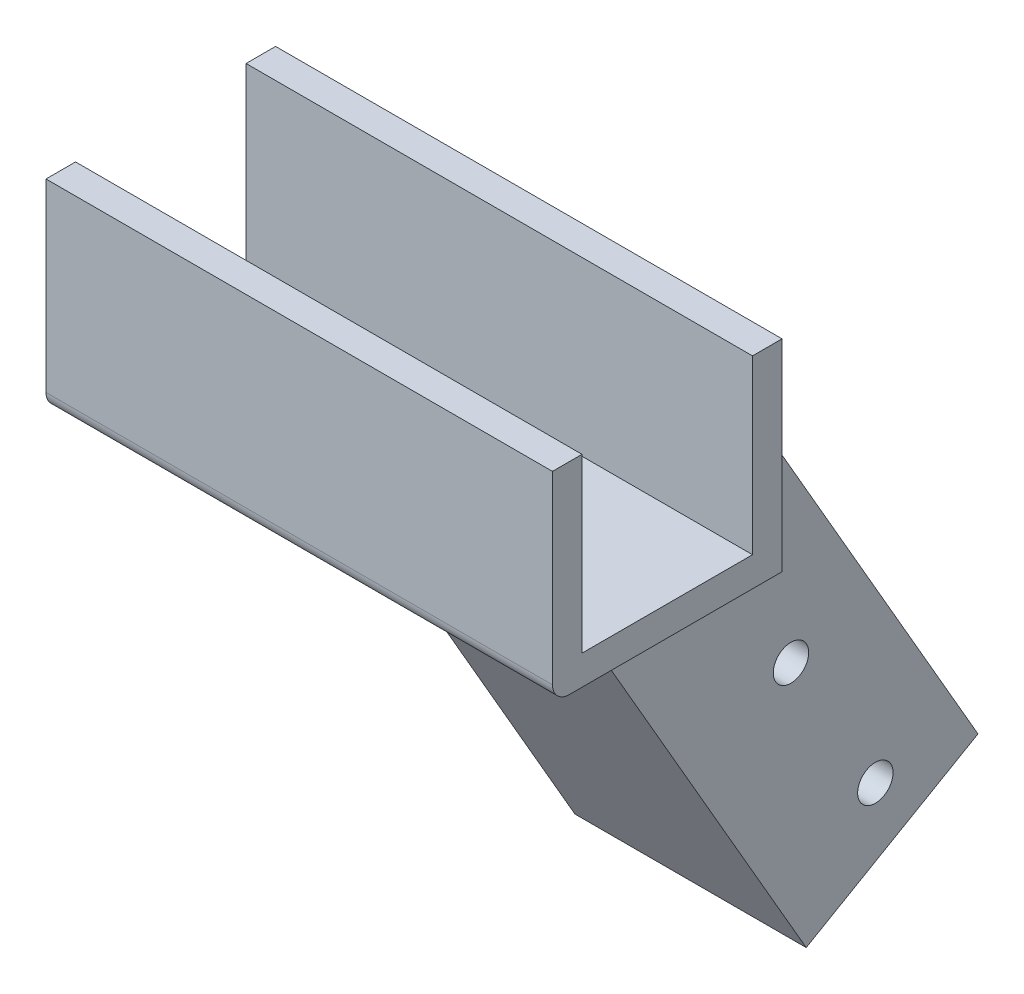
ISO-10303-21;
HEADER;
FILE_DESCRIPTION(('STEP AP214'),'2;1');
FILE_NAME('part.step','',(''),(''),'','','');
FILE_SCHEMA(('AUTOMOTIVE_DESIGN { 1 0 10303 214 1 1 1 1 }'));
ENDSEC;
DATA;
#1=APPLICATION_CONTEXT('core data for automotive mechanical design processes');
#2=APPLICATION_PROTOCOL_DEFINITION('international standard','automotive_design',2000,#1);
#3=PRODUCT_CONTEXT('',#1,'mechanical');
#4=PRODUCT('Part','Part','',(#3));
#5=PRODUCT_RELATED_PRODUCT_CATEGORY('part','',(#4));
#6=PRODUCT_DEFINITION_FORMATION('','',#4);
#7=PRODUCT_DEFINITION_CONTEXT('part definition',#1,'design');
#8=PRODUCT_DEFINITION('design','',#6,#7);
#9=PRODUCT_DEFINITION_SHAPE('','',#8);
#10=(LENGTH_UNIT() NAMED_UNIT(*) SI_UNIT(.MILLI.,.METRE.));
#11=(NAMED_UNIT(*) PLANE_ANGLE_UNIT() SI_UNIT($,.RADIAN.));
#12=(NAMED_UNIT(*) SI_UNIT($,.STERADIAN.) SOLID_ANGLE_UNIT());
#13=UNCERTAINTY_MEASURE_WITH_UNIT(LENGTH_MEASURE(1.E-05),#10,'distance_accuracy_value','');
#14=(GEOMETRIC_REPRESENTATION_CONTEXT(3) GLOBAL_UNCERTAINTY_ASSIGNED_CONTEXT((#13)) GLOBAL_UNIT_ASSIGNED_CONTEXT((#10,
#11,#12)) REPRESENTATION_CONTEXT('',''));
#15=CARTESIAN_POINT('',(0.,0.,0.));
#16=DIRECTION('',(0.,0.,1.));
#17=DIRECTION('',(1.,0.,0.));
#18=AXIS2_PLACEMENT_3D('',#15,#16,#17);
#19=CARTESIAN_POINT('',(13.7,-68.2416512459884,-32.7632087817198));
#20=DIRECTION('',(0.,0.866025403784438,0.500000000000001));
#21=DIRECTION('',(0.,-0.500000000000001,0.866025403784438));
#22=AXIS2_PLACEMENT_3D('',#19,#20,#21);
#23=PLANE('',#22);
#24=DIRECTION('',(0.,0.500000000000001,-0.866025403784438));
#25=VECTOR('',#24,1.);
#26=CARTESIAN_POINT('',(-10.2,-68.2416512459884,-32.7632087817198));
#27=LINE('',#26,#25);
#28=CARTESIAN_POINT('',(-10.2,-66.4916512459884,-35.7942976949653));
#29=VERTEX_POINT('',#28);
#30=CARTESIAN_POINT('',(-10.2,-56.4916512459884,-53.114805770654));
#31=VERTEX_POINT('',#30);
#32=EDGE_CURVE('E366',#29,#31,#27,.T.);
#33=ORIENTED_EDGE('',*,*,#32,.F.);
#34=DIRECTION('',(-1.,0.,0.));
#35=VECTOR('',#34,1.);
#36=CARTESIAN_POINT('',(13.7,-66.4916512459884,-35.7942976949653));
#37=LINE('',#36,#35);
#38=CARTESIAN_POINT('',(10.2,-66.4916512459884,-35.7942976949653));
#39=VERTEX_POINT('',#38);
#40=EDGE_CURVE('E196',#39,#29,#37,.T.);
#41=ORIENTED_EDGE('',*,*,#40,.F.);
#42=DIRECTION('',(0.,0.500000000000001,-0.866025403784438));
#43=VECTOR('',#42,1.);
#44=CARTESIAN_POINT('',(10.2,-68.2416512459884,-32.7632087817198));
#45=LINE('',#44,#43);
#46=CARTESIAN_POINT('',(10.2,-56.4916512459884,-53.114805770654));
#47=VERTEX_POINT('',#46);
#48=EDGE_CURVE('E180',#39,#47,#45,.T.);
#49=ORIENTED_EDGE('',*,*,#48,.T.);
#50=DIRECTION('',(-1.,0.,0.));
#51=VECTOR('',#50,1.);
#52=CARTESIAN_POINT('',(13.7,-56.4916512459884,-53.114805770654));
#53=LINE('',#52,#51);
#54=CARTESIAN_POINT('',(13.7,-56.4916512459884,-53.114805770654));
#55=VERTEX_POINT('',#54);
#56=EDGE_CURVE('E193',#55,#47,#53,.T.);
#57=ORIENTED_EDGE('',*,*,#56,.F.);
#58=DIRECTION('',(0.,0.500000000000001,-0.866025403784438));
#59=VECTOR('',#58,1.);
#60=CARTESIAN_POINT('',(13.7,-68.2416512459884,-32.7632087817198));
#61=LINE('',#60,#59);
#62=CARTESIAN_POINT('',(13.7,-68.2416512459884,-32.7632087817198));
#63=VERTEX_POINT('',#62);
#64=EDGE_CURVE('E325',#63,#55,#61,.T.);
#65=ORIENTED_EDGE('',*,*,#64,.F.);
#66=DIRECTION('',(-1.,0.,0.));
#67=VECTOR('',#66,1.);
#68=CARTESIAN_POINT('',(13.7,-68.2416512459884,-32.7632087817198));
#69=LINE('',#68,#67);
#70=CARTESIAN_POINT('',(-13.7,-68.2416512459884,-32.7632087817198));
#71=VERTEX_POINT('',#70);
#72=EDGE_CURVE('E204',#63,#71,#69,.T.);
#73=ORIENTED_EDGE('',*,*,#72,.T.);
#74=DIRECTION('',(0.,0.500000000000001,-0.866025403784438));
#75=VECTOR('',#74,1.);
#76=CARTESIAN_POINT('',(-13.7,-68.2416512459884,-32.7632087817198));
#77=LINE('',#76,#75);
#78=CARTESIAN_POINT('',(-13.7,-56.4916512459884,-53.114805770654));
#79=VERTEX_POINT('',#78);
#80=EDGE_CURVE('E332',#71,#79,#77,.T.);
#81=ORIENTED_EDGE('',*,*,#80,.T.);
#82=EDGE_CURVE('E205',#31,#79,#53,.T.);
#83=ORIENTED_EDGE('',*,*,#82,.F.);
#84=EDGE_LOOP('',(#33,#41,#49,#57,#65,#73,#81,#83));
#85=FACE_BOUND('',#84,.T.);
#86=ADVANCED_FACE('F33',(#85),#23,.F.);
#87=CARTESIAN_POINT('',(13.7,-56.4916512459884,-53.114805770654));
#88=DIRECTION('',(0.,-0.500000000000001,0.866025403784438));
#89=DIRECTION('',(0.,-0.866025403784438,-0.500000000000001));
#90=AXIS2_PLACEMENT_3D('',#87,#88,#89);
#91=PLANE('',#90);
#92=DIRECTION('',(0.,0.866025403784438,0.500000000000001));
#93=VECTOR('',#92,1.);
#94=CARTESIAN_POINT('',(-10.2,-56.4916512459884,-53.114805770654));
#95=LINE('',#94,#93);
#96=CARTESIAN_POINT('',(-10.2,8.45,-15.6207259421637));
#97=VERTEX_POINT('',#96);
#98=EDGE_CURVE('E344',#31,#97,#95,.T.);
#99=ORIENTED_EDGE('',*,*,#98,.F.);
#100=ORIENTED_EDGE('',*,*,#82,.T.);
#101=DIRECTION('',(0.,0.866025403784438,0.500000000000001));
#102=VECTOR('',#101,1.);
#103=CARTESIAN_POINT('',(-13.7,-56.4916512459884,-53.114805770654));
#104=LINE('',#103,#102);
#105=CARTESIAN_POINT('',(-13.7,11.95,-13.6));
#106=VERTEX_POINT('',#105);
#107=EDGE_CURVE('E335',#79,#106,#104,.T.);
#108=ORIENTED_EDGE('',*,*,#107,.T.);
#109=DIRECTION('',(-1.,0.,0.));
#110=VECTOR('',#109,1.);
#111=CARTESIAN_POINT('',(13.7,11.95,-13.6));
#112=LINE('',#111,#110);
#113=CARTESIAN_POINT('',(13.7,11.95,-13.6));
#114=VERTEX_POINT('',#113);
#115=EDGE_CURVE('E210',#114,#106,#112,.T.);
#116=ORIENTED_EDGE('',*,*,#115,.F.);
#117=DIRECTION('',(0.,0.866025403784438,0.500000000000001));
#118=VECTOR('',#117,1.);
#119=CARTESIAN_POINT('',(13.7,-56.4916512459884,-53.114805770654));
#120=LINE('',#119,#118);
#121=EDGE_CURVE('E203',#55,#114,#120,.T.);
#122=ORIENTED_EDGE('',*,*,#121,.F.);
#123=ORIENTED_EDGE('',*,*,#56,.T.);
#124=DIRECTION('',(0.,0.866025403784438,0.500000000000001));
#125=VECTOR('',#124,1.);
#126=CARTESIAN_POINT('',(10.2,-56.4916512459884,-53.114805770654));
#127=LINE('',#126,#125);
#128=CARTESIAN_POINT('',(10.2,8.45,-15.6207259421637));
#129=VERTEX_POINT('',#128);
#130=EDGE_CURVE('E176',#47,#129,#127,.T.);
#131=ORIENTED_EDGE('',*,*,#130,.T.);
#132=DIRECTION('',(-1.,0.,0.));
#133=VECTOR('',#132,1.);
#134=CARTESIAN_POINT('',(30.,8.45,-15.6207259421637));
#135=LINE('',#134,#133);
#136=EDGE_CURVE('E187',#129,#97,#135,.T.);
#137=ORIENTED_EDGE('',*,*,#136,.T.);
#138=EDGE_LOOP('',(#99,#100,#108,#116,#122,#123,#131,#137));
#139=FACE_BOUND('',#138,.T.);
#140=ADVANCED_FACE('F200',(#139),#91,.F.);
#141=CARTESIAN_POINT('',(30.,-11.95,-13.6));
#142=DIRECTION('',(0.,0.,1.));
#143=DIRECTION('',(1.,0.,0.));
#144=AXIS2_PLACEMENT_3D('',#141,#142,#143);
#145=PLANE('',#144);
#146=DIRECTION('',(0.,-1.,0.));
#147=VECTOR('',#146,1.);
#148=CARTESIAN_POINT('',(-13.7,-11.95,-13.6));
#149=LINE('',#148,#147);
#150=CARTESIAN_POINT('',(-13.7,-11.95,-13.6));
#151=VERTEX_POINT('',#150);
#152=EDGE_CURVE('E316',#106,#151,#149,.T.);
#153=ORIENTED_EDGE('',*,*,#152,.T.);
#154=DIRECTION('',(-1.,0.,0.));
#155=VECTOR('',#154,1.);
#156=CARTESIAN_POINT('',(30.,-11.95,-13.6));
#157=LINE('',#156,#155);
#158=CARTESIAN_POINT('',(-30.,-11.95,-13.6));
#159=VERTEX_POINT('',#158);
#160=EDGE_CURVE('E252',#151,#159,#157,.T.);
#161=ORIENTED_EDGE('',*,*,#160,.T.);
#162=DIRECTION('',(0.,1.,0.));
#163=VECTOR('',#162,1.);
#164=CARTESIAN_POINT('',(-30.,-11.95,-13.6));
#165=LINE('',#164,#163);
#166=CARTESIAN_POINT('',(-30.,11.95,-13.6));
#167=VERTEX_POINT('',#166);
#168=EDGE_CURVE('E238',#159,#167,#165,.T.);
#169=ORIENTED_EDGE('',*,*,#168,.T.);
#170=DIRECTION('',(-1.,0.,0.));
#171=VECTOR('',#170,1.);
#172=CARTESIAN_POINT('',(30.,11.95,-13.6));
#173=LINE('',#172,#171);
#174=EDGE_CURVE('E269',#106,#167,#173,.T.);
#175=ORIENTED_EDGE('',*,*,#174,.F.);
#176=EDGE_LOOP('',(#153,#161,#169,#175));
#177=FACE_BOUND('',#176,.T.);
#178=ADVANCED_FACE('F340',(#177),#145,.F.);
#179=CARTESIAN_POINT('',(30.,11.95,13.6));
#180=DIRECTION('',(0.,-1.,0.));
#181=DIRECTION('',(0.,0.,-1.));
#182=AXIS2_PLACEMENT_3D('',#179,#180,#181);
#183=PLANE('',#182);
#184=DIRECTION('',(-1.,0.,0.));
#185=VECTOR('',#184,1.);
#186=CARTESIAN_POINT('',(30.,11.95,-10.1));
#187=LINE('',#186,#185);
#188=CARTESIAN_POINT('',(30.,11.95,-10.1));
#189=VERTEX_POINT('',#188);
#190=CARTESIAN_POINT('',(-30.,11.95,-10.1));
#191=VERTEX_POINT('',#190);
#192=EDGE_CURVE('E232',#189,#191,#187,.T.);
#193=ORIENTED_EDGE('',*,*,#192,.F.);
#194=DIRECTION('',(0.,0.,1.));
#195=VECTOR('',#194,1.);
#196=CARTESIAN_POINT('',(30.,11.95,13.6));
#197=LINE('',#196,#195);
#198=CARTESIAN_POINT('',(30.,11.95,-13.6));
#199=VERTEX_POINT('',#198);
#200=EDGE_CURVE('E244',#199,#189,#197,.T.);
#201=ORIENTED_EDGE('',*,*,#200,.F.);
#202=EDGE_CURVE('E270',#199,#114,#173,.T.);
#203=ORIENTED_EDGE('',*,*,#202,.T.);
#204=ORIENTED_EDGE('',*,*,#115,.T.);
#205=ORIENTED_EDGE('',*,*,#174,.T.);
#206=DIRECTION('',(0.,0.,1.));
#207=VECTOR('',#206,1.);
#208=CARTESIAN_POINT('',(-30.,11.95,13.6));
#209=LINE('',#208,#207);
#210=EDGE_CURVE('E256',#167,#191,#209,.T.);
#211=ORIENTED_EDGE('',*,*,#210,.T.);
#212=EDGE_LOOP('',(#193,#201,#203,#204,#205,#211));
#213=FACE_BOUND('',#212,.T.);
#214=ADVANCED_FACE('F465',(#213),#183,.F.);
#215=CARTESIAN_POINT('',(30.,0.,0.));
#216=DIRECTION('',(-1.,0.,0.));
#217=DIRECTION('',(0.,0.,1.));
#218=AXIS2_PLACEMENT_3D('',#215,#216,#217);
#219=PLANE('',#218);
#220=DIRECTION('',(0.,-1.,0.));
#221=VECTOR('',#220,1.);
#222=CARTESIAN_POINT('',(30.,-11.95,13.6));
#223=LINE('',#222,#221);
#224=CARTESIAN_POINT('',(30.,11.95,13.6));
#225=VERTEX_POINT('',#224);
#226=CARTESIAN_POINT('',(30.,-9.95,13.6));
#227=VERTEX_POINT('',#226);
#228=EDGE_CURVE('E247',#225,#227,#223,.T.);
#229=ORIENTED_EDGE('',*,*,#228,.T.);
#230=CARTESIAN_POINT('',(30.,-9.95,11.6));
#231=DIRECTION('',(-1.,0.,0.));
#232=DIRECTION('',(0.,0.,1.));
#233=AXIS2_PLACEMENT_3D('',#230,#231,#232);
#234=CIRCLE('',#233,2.);
#235=CARTESIAN_POINT('',(30.,-11.95,11.6));
#236=VERTEX_POINT('',#235);
#237=EDGE_CURVE('E280',#227,#236,#234,.F.);
#238=ORIENTED_EDGE('',*,*,#237,.T.);
#239=DIRECTION('',(0.,0.,-1.));
#240=VECTOR('',#239,1.);
#241=CARTESIAN_POINT('',(30.,-11.95,13.6));
#242=LINE('',#241,#240);
#243=CARTESIAN_POINT('',(30.,-11.95,-13.6));
#244=VERTEX_POINT('',#243);
#245=EDGE_CURVE('E250',#236,#244,#242,.T.);
#246=ORIENTED_EDGE('',*,*,#245,.T.);
#247=DIRECTION('',(0.,1.,0.));
#248=VECTOR('',#247,1.);
#249=CARTESIAN_POINT('',(30.,-11.95,-13.6));
#250=LINE('',#249,#248);
#251=EDGE_CURVE('E239',#244,#199,#250,.T.);
#252=ORIENTED_EDGE('',*,*,#251,.T.);
#253=ORIENTED_EDGE('',*,*,#200,.T.);
#254=DIRECTION('',(0.,1.,0.));
#255=VECTOR('',#254,1.);
#256=CARTESIAN_POINT('',(30.,0.,-10.1));
#257=LINE('',#256,#255);
#258=CARTESIAN_POINT('',(30.,-8.45,-10.1));
#259=VERTEX_POINT('',#258);
#260=EDGE_CURVE('E227',#259,#189,#257,.T.);
#261=ORIENTED_EDGE('',*,*,#260,.F.);
#262=DIRECTION('',(0.,0.,-1.));
#263=VECTOR('',#262,1.);
#264=CARTESIAN_POINT('',(30.,-8.45,0.));
#265=LINE('',#264,#263);
#266=CARTESIAN_POINT('',(30.,-8.45,10.1));
#267=VERTEX_POINT('',#266);
#268=EDGE_CURVE('E217',#267,#259,#265,.T.);
#269=ORIENTED_EDGE('',*,*,#268,.F.);
#270=DIRECTION('',(0.,-1.,0.));
#271=VECTOR('',#270,1.);
#272=CARTESIAN_POINT('',(30.,0.,10.1));
#273=LINE('',#272,#271);
#274=CARTESIAN_POINT('',(30.,11.95,10.1));
#275=VERTEX_POINT('',#274);
#276=EDGE_CURVE('E233',#275,#267,#273,.T.);
#277=ORIENTED_EDGE('',*,*,#276,.F.);
#278=EDGE_CURVE('E242',#275,#225,#197,.T.);
#279=ORIENTED_EDGE('',*,*,#278,.T.);
#280=EDGE_LOOP('',(#229,#238,#246,#252,#253,#261,#269,#277,#279));
#281=FACE_BOUND('',#280,.T.);
#282=ADVANCED_FACE('F461',(#281),#219,.F.);
#283=CARTESIAN_POINT('',(-30.,0.,0.));
#284=DIRECTION('',(-1.,0.,0.));
#285=DIRECTION('',(0.,0.,1.));
#286=AXIS2_PLACEMENT_3D('',#283,#284,#285);
#287=PLANE('',#286);
#288=DIRECTION('',(0.,0.,-1.));
#289=VECTOR('',#288,1.);
#290=CARTESIAN_POINT('',(-30.,-11.95,13.6));
#291=LINE('',#290,#289);
#292=CARTESIAN_POINT('',(-30.,-11.95,11.6));
#293=VERTEX_POINT('',#292);
#294=EDGE_CURVE('E243',#293,#159,#291,.T.);
#295=ORIENTED_EDGE('',*,*,#294,.F.);
#296=CARTESIAN_POINT('',(-30.,-9.95,11.6));
#297=DIRECTION('',(-1.,0.,0.));
#298=DIRECTION('',(0.,0.,1.));
#299=AXIS2_PLACEMENT_3D('',#296,#297,#298);
#300=CIRCLE('',#299,2.);
#301=CARTESIAN_POINT('',(-30.,-9.95,13.6));
#302=VERTEX_POINT('',#301);
#303=EDGE_CURVE('E276',#293,#302,#300,.T.);
#304=ORIENTED_EDGE('',*,*,#303,.T.);
#305=DIRECTION('',(0.,-1.,0.));
#306=VECTOR('',#305,1.);
#307=CARTESIAN_POINT('',(-30.,-11.95,13.6));
#308=LINE('',#307,#306);
#309=CARTESIAN_POINT('',(-30.,11.95,13.6));
#310=VERTEX_POINT('',#309);
#311=EDGE_CURVE('E259',#310,#302,#308,.T.);
#312=ORIENTED_EDGE('',*,*,#311,.F.);
#313=CARTESIAN_POINT('',(-30.,11.95,10.1));
#314=VERTEX_POINT('',#313);
#315=EDGE_CURVE('E255',#314,#310,#209,.T.);
#316=ORIENTED_EDGE('',*,*,#315,.F.);
#317=DIRECTION('',(0.,-1.,0.));
#318=VECTOR('',#317,1.);
#319=CARTESIAN_POINT('',(-30.,0.,10.1));
#320=LINE('',#319,#318);
#321=CARTESIAN_POINT('',(-30.,-8.45,10.1));
#322=VERTEX_POINT('',#321);
#323=EDGE_CURVE('E223',#314,#322,#320,.T.);
#324=ORIENTED_EDGE('',*,*,#323,.T.);
#325=DIRECTION('',(0.,0.,-1.));
#326=VECTOR('',#325,1.);
#327=CARTESIAN_POINT('',(-30.,-8.45,0.));
#328=LINE('',#327,#326);
#329=CARTESIAN_POINT('',(-30.,-8.45,-10.1));
#330=VERTEX_POINT('',#329);
#331=EDGE_CURVE('E224',#322,#330,#328,.T.);
#332=ORIENTED_EDGE('',*,*,#331,.T.);
#333=DIRECTION('',(0.,1.,0.));
#334=VECTOR('',#333,1.);
#335=CARTESIAN_POINT('',(-30.,0.,-10.1));
#336=LINE('',#335,#334);
#337=EDGE_CURVE('E208',#330,#191,#336,.T.);
#338=ORIENTED_EDGE('',*,*,#337,.T.);
#339=ORIENTED_EDGE('',*,*,#210,.F.);
#340=ORIENTED_EDGE('',*,*,#168,.F.);
#341=EDGE_LOOP('',(#295,#304,#312,#316,#324,#332,#338,#339,#340));
#342=FACE_BOUND('',#341,.T.);
#343=ADVANCED_FACE('F464',(#342),#287,.T.);
#344=CARTESIAN_POINT('',(13.7,-11.95,-13.6));
#345=VERTEX_POINT('',#344);
#346=EDGE_CURVE('E263',#244,#345,#157,.T.);
#347=ORIENTED_EDGE('',*,*,#346,.T.);
#348=DIRECTION('',(0.,-1.,0.));
#349=VECTOR('',#348,1.);
#350=CARTESIAN_POINT('',(13.7,-11.95,-13.6));
#351=LINE('',#350,#349);
#352=EDGE_CURVE('E321',#114,#345,#351,.T.);
#353=ORIENTED_EDGE('',*,*,#352,.F.);
#354=ORIENTED_EDGE('',*,*,#202,.F.);
#355=ORIENTED_EDGE('',*,*,#251,.F.);
#356=EDGE_LOOP('',(#347,#353,#354,#355));
#357=FACE_BOUND('',#356,.T.);
#358=ADVANCED_FACE('F319',(#357),#145,.F.);
#359=ORIENTED_EDGE('',*,*,#278,.F.);
#360=DIRECTION('',(-1.,0.,0.));
#361=VECTOR('',#360,1.);
#362=CARTESIAN_POINT('',(30.,11.95,10.1));
#363=LINE('',#362,#361);
#364=EDGE_CURVE('E220',#275,#314,#363,.T.);
#365=ORIENTED_EDGE('',*,*,#364,.T.);
#366=ORIENTED_EDGE('',*,*,#315,.T.);
#367=DIRECTION('',(-1.,0.,0.));
#368=VECTOR('',#367,1.);
#369=CARTESIAN_POINT('',(30.,11.95,13.6));
#370=LINE('',#369,#368);
#371=EDGE_CURVE('E266',#225,#310,#370,.T.);
#372=ORIENTED_EDGE('',*,*,#371,.F.);
#373=EDGE_LOOP('',(#359,#365,#366,#372));
#374=FACE_BOUND('',#373,.T.);
#375=ADVANCED_FACE('F475',(#374),#183,.F.);
#376=CARTESIAN_POINT('',(30.,-11.95,13.6));
#377=DIRECTION('',(0.,0.,-1.));
#378=DIRECTION('',(-1.,0.,0.));
#379=AXIS2_PLACEMENT_3D('',#376,#377,#378);
#380=PLANE('',#379);
#381=ORIENTED_EDGE('',*,*,#311,.T.);
#382=DIRECTION('',(-1.,0.,0.));
#383=VECTOR('',#382,1.);
#384=CARTESIAN_POINT('',(30.,-9.95,13.6));
#385=LINE('',#384,#383);
#386=EDGE_CURVE('E278',#302,#227,#385,.F.);
#387=ORIENTED_EDGE('',*,*,#386,.T.);
#388=ORIENTED_EDGE('',*,*,#228,.F.);
#389=ORIENTED_EDGE('',*,*,#371,.T.);
#390=EDGE_LOOP('',(#381,#387,#388,#389));
#391=FACE_BOUND('',#390,.T.);
#392=ADVANCED_FACE('F472',(#391),#380,.F.);
#393=CARTESIAN_POINT('',(30.,-11.95,13.6));
#394=DIRECTION('',(0.,1.,0.));
#395=DIRECTION('',(0.,0.,1.));
#396=AXIS2_PLACEMENT_3D('',#393,#394,#395);
#397=PLANE('',#396);
#398=DIRECTION('',(0.,0.,1.));
#399=VECTOR('',#398,1.);
#400=CARTESIAN_POINT('',(-13.7,-11.95,-0.263208781719682));
#401=LINE('',#400,#399);
#402=CARTESIAN_POINT('',(-13.7,-11.95,5.51029391017654));
#403=VERTEX_POINT('',#402);
#404=EDGE_CURVE('E48',#151,#403,#401,.T.);
#405=ORIENTED_EDGE('',*,*,#404,.T.);
#406=DIRECTION('',(-1.,0.,0.));
#407=VECTOR('',#406,1.);
#408=CARTESIAN_POINT('',(13.7,-11.95,5.51029391017654));
#409=LINE('',#408,#407);
#410=CARTESIAN_POINT('',(13.7,-11.9499999999999,5.51029391017654));
#411=VERTEX_POINT('',#410);
#412=EDGE_CURVE('E300',#403,#411,#409,.F.);
#413=ORIENTED_EDGE('',*,*,#412,.T.);
#414=DIRECTION('',(0.,0.,1.));
#415=VECTOR('',#414,1.);
#416=CARTESIAN_POINT('',(13.7,-11.95,-0.263208781719682));
#417=LINE('',#416,#415);
#418=EDGE_CURVE('E55',#345,#411,#417,.T.);
#419=ORIENTED_EDGE('',*,*,#418,.F.);
#420=ORIENTED_EDGE('',*,*,#346,.F.);
#421=ORIENTED_EDGE('',*,*,#245,.F.);
#422=DIRECTION('',(-1.,0.,0.));
#423=VECTOR('',#422,1.);
#424=CARTESIAN_POINT('',(30.,-11.95,11.6));
#425=LINE('',#424,#423);
#426=EDGE_CURVE('E273',#236,#293,#425,.T.);
#427=ORIENTED_EDGE('',*,*,#426,.T.);
#428=ORIENTED_EDGE('',*,*,#294,.T.);
#429=ORIENTED_EDGE('',*,*,#160,.F.);
#430=EDGE_LOOP('',(#405,#413,#419,#420,#421,#427,#428,#429));
#431=FACE_BOUND('',#430,.T.);
#432=ADVANCED_FACE('F311',(#431),#397,.F.);
#433=CARTESIAN_POINT('',(30.,-11.95,-10.1));
#434=DIRECTION('',(0.,0.,1.));
#435=DIRECTION('',(1.,0.,0.));
#436=AXIS2_PLACEMENT_3D('',#433,#434,#435);
#437=PLANE('',#436);
#438=ORIENTED_EDGE('',*,*,#337,.F.);
#439=DIRECTION('',(-1.,0.,0.));
#440=VECTOR('',#439,1.);
#441=CARTESIAN_POINT('',(30.,-8.45,-10.1));
#442=LINE('',#441,#440);
#443=EDGE_CURVE('E214',#259,#330,#442,.T.);
#444=ORIENTED_EDGE('',*,*,#443,.F.);
#445=ORIENTED_EDGE('',*,*,#260,.T.);
#446=ORIENTED_EDGE('',*,*,#192,.T.);
#447=EDGE_LOOP('',(#438,#444,#445,#446));
#448=FACE_BOUND('',#447,.T.);
#449=ADVANCED_FACE('F450',(#448),#437,.T.);
#450=CARTESIAN_POINT('',(30.,-11.95,10.1));
#451=DIRECTION('',(0.,0.,-1.));
#452=DIRECTION('',(-1.,0.,0.));
#453=AXIS2_PLACEMENT_3D('',#450,#451,#452);
#454=PLANE('',#453);
#455=ORIENTED_EDGE('',*,*,#323,.F.);
#456=ORIENTED_EDGE('',*,*,#364,.F.);
#457=ORIENTED_EDGE('',*,*,#276,.T.);
#458=DIRECTION('',(-1.,0.,0.));
#459=VECTOR('',#458,1.);
#460=CARTESIAN_POINT('',(30.,-8.45,10.1));
#461=LINE('',#460,#459);
#462=EDGE_CURVE('E216',#267,#322,#461,.T.);
#463=ORIENTED_EDGE('',*,*,#462,.T.);
#464=EDGE_LOOP('',(#455,#456,#457,#463));
#465=FACE_BOUND('',#464,.T.);
#466=ADVANCED_FACE('F453',(#465),#454,.T.);
#467=CARTESIAN_POINT('',(30.,-8.45,13.6));
#468=DIRECTION('',(0.,1.,0.));
#469=DIRECTION('',(0.,0.,1.));
#470=AXIS2_PLACEMENT_3D('',#467,#468,#469);
#471=PLANE('',#470);
#472=ORIENTED_EDGE('',*,*,#331,.F.);
#473=ORIENTED_EDGE('',*,*,#462,.F.);
#474=ORIENTED_EDGE('',*,*,#268,.T.);
#475=ORIENTED_EDGE('',*,*,#443,.T.);
#476=EDGE_LOOP('',(#472,#473,#474,#475));
#477=FACE_BOUND('',#476,.T.);
#478=ADVANCED_FACE('F449',(#477),#471,.T.);
#479=CARTESIAN_POINT('',(13.7,-11.95,-0.263208781719682));
#480=DIRECTION('',(0.,0.500000000000001,-0.866025403784438));
#481=DIRECTION('',(0.,0.866025403784438,0.500000000000001));
#482=AXIS2_PLACEMENT_3D('',#479,#480,#481);
#483=PLANE('',#482);
#484=DIRECTION('',(0.,-0.866025403784438,-0.500000000000001));
#485=VECTOR('',#484,1.);
#486=CARTESIAN_POINT('',(13.7,-11.95,-0.263208781719682));
#487=LINE('',#486,#485);
#488=CARTESIAN_POINT('',(13.7,-16.95,-3.14996012766784));
#489=VERTEX_POINT('',#488);
#490=EDGE_CURVE('E315',#489,#63,#487,.T.);
#491=ORIENTED_EDGE('',*,*,#490,.F.);
#492=DIRECTION('',(-1.,0.,0.));
#493=VECTOR('',#492,1.);
#494=CARTESIAN_POINT('',(-13.7,-16.95,-3.14996012766784));
#495=LINE('',#494,#493);
#496=CARTESIAN_POINT('',(-13.7,-16.95,-3.14996012766784));
#497=VERTEX_POINT('',#496);
#498=EDGE_CURVE('E282',#489,#497,#495,.T.);
#499=ORIENTED_EDGE('',*,*,#498,.T.);
#500=DIRECTION('',(0.,-0.866025403784438,-0.500000000000001));
#501=VECTOR('',#500,1.);
#502=CARTESIAN_POINT('',(-13.7,-11.95,-0.263208781719682));
#503=LINE('',#502,#501);
#504=EDGE_CURVE('E307',#497,#71,#503,.T.);
#505=ORIENTED_EDGE('',*,*,#504,.T.);
#506=ORIENTED_EDGE('',*,*,#72,.F.);
#507=EDGE_LOOP('',(#491,#499,#505,#506));
#508=FACE_BOUND('',#507,.T.);
#509=ADVANCED_FACE('F348',(#508),#483,.F.);
#510=CARTESIAN_POINT('',(13.7,0.,0.));
#511=DIRECTION('',(1.,0.,0.));
#512=DIRECTION('',(0.,0.,-1.));
#513=AXIS2_PLACEMENT_3D('',#510,#511,#512);
#514=PLANE('',#513);
#515=CARTESIAN_POINT('',(13.7,-55.4294734194973,-40.9545517328097));
#516=DIRECTION('',(1.,0.,0.));
#517=DIRECTION('',(0.,0.,-1.));
#518=AXIS2_PLACEMENT_3D('',#515,#516,#517);
#519=CIRCLE('',#518,2.1);
#520=CARTESIAN_POINT('',(13.7,-55.4294734194973,-43.0545517328097));
#521=VERTEX_POINT('',#520);
#522=EDGE_CURVE('E287',#521,#521,#519,.T.);
#523=ORIENTED_EDGE('',*,*,#522,.F.);
#524=EDGE_LOOP('',(#523));
#525=FACE_BOUND('',#524,.T.);
#526=CARTESIAN_POINT('',(13.7,-38.1089653438086,-30.9545517328097));
#527=DIRECTION('',(1.,0.,0.));
#528=DIRECTION('',(0.,0.,-1.));
#529=AXIS2_PLACEMENT_3D('',#526,#527,#528);
#530=CIRCLE('',#529,2.1);
#531=CARTESIAN_POINT('',(13.7,-38.1089653438086,-33.0545517328097));
#532=VERTEX_POINT('',#531);
#533=EDGE_CURVE('E398',#532,#532,#530,.T.);
#534=ORIENTED_EDGE('',*,*,#533,.F.);
#535=EDGE_LOOP('',(#534));
#536=FACE_BOUND('',#535,.T.);
#537=CARTESIAN_POINT('',(13.7,-20.7884572681198,-20.9545517328097));
#538=DIRECTION('',(1.,0.,0.));
#539=DIRECTION('',(0.,0.,-1.));
#540=AXIS2_PLACEMENT_3D('',#537,#538,#539);
#541=CIRCLE('',#540,2.1);
#542=CARTESIAN_POINT('',(13.7,-20.7884572681198,-23.0545517328097));
#543=VERTEX_POINT('',#542);
#544=EDGE_CURVE('E395',#543,#543,#541,.T.);
#545=ORIENTED_EDGE('',*,*,#544,.F.);
#546=EDGE_LOOP('',(#545));
#547=FACE_BOUND('',#546,.T.);
#548=ORIENTED_EDGE('',*,*,#418,.T.);
#549=CARTESIAN_POINT('',(13.7,-21.95,5.51029391017654));
#550=DIRECTION('',(1.,0.,0.));
#551=DIRECTION('',(0.,0.,-1.));
#552=AXIS2_PLACEMENT_3D('',#549,#550,#551);
#553=CIRCLE('',#552,10.);
#554=EDGE_CURVE('E11',#411,#489,#553,.F.);
#555=ORIENTED_EDGE('',*,*,#554,.T.);
#556=ORIENTED_EDGE('',*,*,#490,.T.);
#557=ORIENTED_EDGE('',*,*,#64,.T.);
#558=ORIENTED_EDGE('',*,*,#121,.T.);
#559=ORIENTED_EDGE('',*,*,#352,.T.);
#560=EDGE_LOOP('',(#548,#555,#556,#557,#558,#559));
#561=FACE_BOUND('',#560,.T.);
#562=ADVANCED_FACE('F322',(#525,#536,#547,#561),#514,.T.);
#563=CARTESIAN_POINT('',(-13.7,0.,0.));
#564=DIRECTION('',(1.,0.,0.));
#565=DIRECTION('',(0.,0.,-1.));
#566=AXIS2_PLACEMENT_3D('',#563,#564,#565);
#567=PLANE('',#566);
#568=CARTESIAN_POINT('',(-13.7,-55.4294734194973,-40.9545517328097));
#569=DIRECTION('',(1.,0.,0.));
#570=DIRECTION('',(0.,0.,-1.));
#571=AXIS2_PLACEMENT_3D('',#568,#569,#570);
#572=CIRCLE('',#571,2.1);
#573=CARTESIAN_POINT('',(-13.7,-55.4294734194973,-43.0545517328097));
#574=VERTEX_POINT('',#573);
#575=EDGE_CURVE('E378',#574,#574,#572,.T.);
#576=ORIENTED_EDGE('',*,*,#575,.T.);
#577=EDGE_LOOP('',(#576));
#578=FACE_BOUND('',#577,.T.);
#579=CARTESIAN_POINT('',(-13.7,-38.1089653438086,-30.9545517328097));
#580=DIRECTION('',(1.,0.,0.));
#581=DIRECTION('',(0.,0.,-1.));
#582=AXIS2_PLACEMENT_3D('',#579,#580,#581);
#583=CIRCLE('',#582,2.1);
#584=CARTESIAN_POINT('',(-13.7,-38.1089653438086,-33.0545517328097));
#585=VERTEX_POINT('',#584);
#586=EDGE_CURVE('E297',#585,#585,#583,.T.);
#587=ORIENTED_EDGE('',*,*,#586,.T.);
#588=EDGE_LOOP('',(#587));
#589=FACE_BOUND('',#588,.T.);
#590=CARTESIAN_POINT('',(-13.7,-20.7884572681198,-20.9545517328097));
#591=DIRECTION('',(1.,0.,0.));
#592=DIRECTION('',(0.,0.,-1.));
#593=AXIS2_PLACEMENT_3D('',#590,#591,#592);
#594=CIRCLE('',#593,2.1);
#595=CARTESIAN_POINT('',(-13.7,-20.7884572681198,-23.0545517328097));
#596=VERTEX_POINT('',#595);
#597=EDGE_CURVE('E292',#596,#596,#594,.T.);
#598=ORIENTED_EDGE('',*,*,#597,.T.);
#599=EDGE_LOOP('',(#598));
#600=FACE_BOUND('',#599,.T.);
#601=ORIENTED_EDGE('',*,*,#404,.F.);
#602=ORIENTED_EDGE('',*,*,#152,.F.);
#603=ORIENTED_EDGE('',*,*,#107,.F.);
#604=ORIENTED_EDGE('',*,*,#80,.F.);
#605=ORIENTED_EDGE('',*,*,#504,.F.);
#606=CARTESIAN_POINT('',(-13.7,-21.95,5.51029391017654));
#607=DIRECTION('',(1.,0.,0.));
#608=DIRECTION('',(0.,0.,-1.));
#609=AXIS2_PLACEMENT_3D('',#606,#607,#608);
#610=CIRCLE('',#609,10.);
#611=EDGE_CURVE('E41',#497,#403,#610,.T.);
#612=ORIENTED_EDGE('',*,*,#611,.T.);
#613=EDGE_LOOP('',(#601,#602,#603,#604,#605,#612));
#614=FACE_BOUND('',#613,.T.);
#615=ADVANCED_FACE('F304',(#578,#589,#600,#614),#567,.F.);
#616=CARTESIAN_POINT('',(30.,8.45,13.6));
#617=DIRECTION('',(0.,-1.,0.));
#618=DIRECTION('',(0.,0.,-1.));
#619=AXIS2_PLACEMENT_3D('',#616,#617,#618);
#620=PLANE('',#619);
#621=DIRECTION('',(0.,0.,-1.));
#622=VECTOR('',#621,1.);
#623=CARTESIAN_POINT('',(-10.2,8.45,0.));
#624=LINE('',#623,#622);
#625=CARTESIAN_POINT('',(-10.2,8.45,-13.6));
#626=VERTEX_POINT('',#625);
#627=EDGE_CURVE('E364',#626,#97,#624,.T.);
#628=ORIENTED_EDGE('',*,*,#627,.T.);
#629=ORIENTED_EDGE('',*,*,#136,.F.);
#630=DIRECTION('',(0.,0.,-1.));
#631=VECTOR('',#630,1.);
#632=CARTESIAN_POINT('',(10.2,8.45,0.));
#633=LINE('',#632,#631);
#634=CARTESIAN_POINT('',(10.2,8.45,-13.6));
#635=VERTEX_POINT('',#634);
#636=EDGE_CURVE('E183',#635,#129,#633,.T.);
#637=ORIENTED_EDGE('',*,*,#636,.F.);
#638=DIRECTION('',(-1.,0.,0.));
#639=VECTOR('',#638,1.);
#640=CARTESIAN_POINT('',(30.,8.45,-13.6));
#641=LINE('',#640,#639);
#642=EDGE_CURVE('E375',#635,#626,#641,.T.);
#643=ORIENTED_EDGE('',*,*,#642,.T.);
#644=EDGE_LOOP('',(#628,#629,#637,#643));
#645=FACE_BOUND('',#644,.T.);
#646=ADVANCED_FACE('F526',(#645),#620,.T.);
#647=CARTESIAN_POINT('',(30.,-11.95,-13.6));
#648=DIRECTION('',(0.,0.,1.));
#649=DIRECTION('',(1.,0.,0.));
#650=AXIS2_PLACEMENT_3D('',#647,#648,#649);
#651=PLANE('',#650);
#652=DIRECTION('',(0.,1.,0.));
#653=VECTOR('',#652,1.);
#654=CARTESIAN_POINT('',(-10.2,-11.95,-13.6));
#655=LINE('',#654,#653);
#656=CARTESIAN_POINT('',(-10.2,-11.95,-13.6));
#657=VERTEX_POINT('',#656);
#658=EDGE_CURVE('E359',#657,#626,#655,.T.);
#659=ORIENTED_EDGE('',*,*,#658,.T.);
#660=ORIENTED_EDGE('',*,*,#642,.F.);
#661=DIRECTION('',(0.,-1.,0.));
#662=VECTOR('',#661,1.);
#663=CARTESIAN_POINT('',(10.2,0.,-13.6));
#664=LINE('',#663,#662);
#665=CARTESIAN_POINT('',(10.2,-11.95,-13.6));
#666=VERTEX_POINT('',#665);
#667=EDGE_CURVE('E361',#635,#666,#664,.T.);
#668=ORIENTED_EDGE('',*,*,#667,.T.);
#669=DIRECTION('',(-1.,0.,0.));
#670=VECTOR('',#669,1.);
#671=CARTESIAN_POINT('',(30.,-11.95,-13.6));
#672=LINE('',#671,#670);
#673=EDGE_CURVE('E369',#666,#657,#672,.T.);
#674=ORIENTED_EDGE('',*,*,#673,.T.);
#675=EDGE_LOOP('',(#659,#660,#668,#674));
#676=FACE_BOUND('',#675,.T.);
#677=ADVANCED_FACE('F531',(#676),#651,.F.);
#678=CARTESIAN_POINT('',(30.,-11.95,13.6));
#679=DIRECTION('',(0.,1.,0.));
#680=DIRECTION('',(0.,0.,1.));
#681=AXIS2_PLACEMENT_3D('',#678,#679,#680);
#682=PLANE('',#681);
#683=DIRECTION('',(-1.,0.,0.));
#684=VECTOR('',#683,1.);
#685=CARTESIAN_POINT('',(30.,-11.95,-4.30466066604709));
#686=LINE('',#685,#684);
#687=CARTESIAN_POINT('',(10.2,-11.95,-4.30466066604709));
#688=VERTEX_POINT('',#687);
#689=CARTESIAN_POINT('',(-10.2,-11.95,-4.30466066604709));
#690=VERTEX_POINT('',#689);
#691=EDGE_CURVE('E330',#688,#690,#686,.T.);
#692=ORIENTED_EDGE('',*,*,#691,.T.);
#693=DIRECTION('',(0.,0.,-1.));
#694=VECTOR('',#693,1.);
#695=CARTESIAN_POINT('',(-10.2,-11.95,13.6));
#696=LINE('',#695,#694);
#697=EDGE_CURVE('E353',#690,#657,#696,.T.);
#698=ORIENTED_EDGE('',*,*,#697,.T.);
#699=ORIENTED_EDGE('',*,*,#673,.F.);
#700=DIRECTION('',(0.,0.,1.));
#701=VECTOR('',#700,1.);
#702=CARTESIAN_POINT('',(10.2,-11.95,0.));
#703=LINE('',#702,#701);
#704=EDGE_CURVE('E356',#666,#688,#703,.T.);
#705=ORIENTED_EDGE('',*,*,#704,.T.);
#706=EDGE_LOOP('',(#692,#698,#699,#705));
#707=FACE_BOUND('',#706,.T.);
#708=ADVANCED_FACE('F435',(#707),#682,.F.);
#709=CARTESIAN_POINT('',(13.7,-10.1999999999999,-3.29429769496522));
#710=DIRECTION('',(0.,0.500000000000001,-0.866025403784438));
#711=DIRECTION('',(0.,0.866025403784438,0.500000000000001));
#712=AXIS2_PLACEMENT_3D('',#709,#710,#711);
#713=PLANE('',#712);
#714=DIRECTION('',(0.,-0.866025403784438,-0.500000000000001));
#715=VECTOR('',#714,1.);
#716=CARTESIAN_POINT('',(10.2,-10.1999999999999,-3.29429769496522));
#717=LINE('',#716,#715);
#718=EDGE_CURVE('E197',#688,#39,#717,.T.);
#719=ORIENTED_EDGE('',*,*,#718,.T.);
#720=ORIENTED_EDGE('',*,*,#40,.T.);
#721=DIRECTION('',(0.,-0.866025403784438,-0.500000000000001));
#722=VECTOR('',#721,1.);
#723=CARTESIAN_POINT('',(-10.2,-10.1999999999999,-3.29429769496522));
#724=LINE('',#723,#722);
#725=EDGE_CURVE('E368',#690,#29,#724,.T.);
#726=ORIENTED_EDGE('',*,*,#725,.F.);
#727=ORIENTED_EDGE('',*,*,#691,.F.);
#728=EDGE_LOOP('',(#719,#720,#726,#727));
#729=FACE_BOUND('',#728,.T.);
#730=ADVANCED_FACE('F425',(#729),#713,.T.);
#731=CARTESIAN_POINT('',(10.2,0.,0.));
#732=DIRECTION('',(1.,0.,0.));
#733=DIRECTION('',(0.,0.,-1.));
#734=AXIS2_PLACEMENT_3D('',#731,#732,#733);
#735=PLANE('',#734);
#736=CARTESIAN_POINT('',(10.2,-55.4294734194973,-40.9545517328097));
#737=DIRECTION('',(1.,0.,0.));
#738=DIRECTION('',(0.,0.,-1.));
#739=AXIS2_PLACEMENT_3D('',#736,#737,#738);
#740=CIRCLE('',#739,2.1);
#741=CARTESIAN_POINT('',(10.2,-55.4294734194973,-43.0545517328097));
#742=VERTEX_POINT('',#741);
#743=EDGE_CURVE('E296',#742,#742,#740,.T.);
#744=ORIENTED_EDGE('',*,*,#743,.T.);
#745=EDGE_LOOP('',(#744));
#746=FACE_BOUND('',#745,.T.);
#747=CARTESIAN_POINT('',(10.2,-38.1089653438086,-30.9545517328097));
#748=DIRECTION('',(1.,0.,0.));
#749=DIRECTION('',(0.,0.,-1.));
#750=AXIS2_PLACEMENT_3D('',#747,#748,#749);
#751=CIRCLE('',#750,2.1);
#752=CARTESIAN_POINT('',(10.2,-38.1089653438086,-33.0545517328097));
#753=VERTEX_POINT('',#752);
#754=EDGE_CURVE('E291',#753,#753,#751,.T.);
#755=ORIENTED_EDGE('',*,*,#754,.T.);
#756=EDGE_LOOP('',(#755));
#757=FACE_BOUND('',#756,.T.);
#758=CARTESIAN_POINT('',(10.2,-20.7884572681198,-20.9545517328097));
#759=DIRECTION('',(1.,0.,0.));
#760=DIRECTION('',(0.,0.,-1.));
#761=AXIS2_PLACEMENT_3D('',#758,#759,#760);
#762=CIRCLE('',#761,2.1);
#763=CARTESIAN_POINT('',(10.2,-20.7884572681198,-23.0545517328097));
#764=VERTEX_POINT('',#763);
#765=EDGE_CURVE('E286',#764,#764,#762,.T.);
#766=ORIENTED_EDGE('',*,*,#765,.T.);
#767=EDGE_LOOP('',(#766));
#768=FACE_BOUND('',#767,.T.);
#769=ORIENTED_EDGE('',*,*,#667,.F.);
#770=ORIENTED_EDGE('',*,*,#636,.T.);
#771=ORIENTED_EDGE('',*,*,#130,.F.);
#772=ORIENTED_EDGE('',*,*,#48,.F.);
#773=ORIENTED_EDGE('',*,*,#718,.F.);
#774=ORIENTED_EDGE('',*,*,#704,.F.);
#775=EDGE_LOOP('',(#769,#770,#771,#772,#773,#774));
#776=FACE_BOUND('',#775,.T.);
#777=ADVANCED_FACE('F178',(#746,#757,#768,#776),#735,.F.);
#778=CARTESIAN_POINT('',(-10.2,0.,0.));
#779=DIRECTION('',(1.,0.,0.));
#780=DIRECTION('',(0.,0.,-1.));
#781=AXIS2_PLACEMENT_3D('',#778,#779,#780);
#782=PLANE('',#781);
#783=CARTESIAN_POINT('',(-10.2,-55.4294734194973,-40.9545517328097));
#784=DIRECTION('',(1.,0.,0.));
#785=DIRECTION('',(0.,0.,-1.));
#786=AXIS2_PLACEMENT_3D('',#783,#784,#785);
#787=CIRCLE('',#786,2.1);
#788=CARTESIAN_POINT('',(-10.2,-55.4294734194973,-43.0545517328097));
#789=VERTEX_POINT('',#788);
#790=EDGE_CURVE('E293',#789,#789,#787,.T.);
#791=ORIENTED_EDGE('',*,*,#790,.F.);
#792=EDGE_LOOP('',(#791));
#793=FACE_BOUND('',#792,.T.);
#794=CARTESIAN_POINT('',(-10.2,-38.1089653438086,-30.9545517328097));
#795=DIRECTION('',(1.,0.,0.));
#796=DIRECTION('',(0.,0.,-1.));
#797=AXIS2_PLACEMENT_3D('',#794,#795,#796);
#798=CIRCLE('',#797,2.1);
#799=CARTESIAN_POINT('',(-10.2,-38.1089653438086,-33.0545517328097));
#800=VERTEX_POINT('',#799);
#801=EDGE_CURVE('E288',#800,#800,#798,.T.);
#802=ORIENTED_EDGE('',*,*,#801,.F.);
#803=EDGE_LOOP('',(#802));
#804=FACE_BOUND('',#803,.T.);
#805=CARTESIAN_POINT('',(-10.2,-20.7884572681198,-20.9545517328097));
#806=DIRECTION('',(1.,0.,0.));
#807=DIRECTION('',(0.,0.,-1.));
#808=AXIS2_PLACEMENT_3D('',#805,#806,#807);
#809=CIRCLE('',#808,2.1);
#810=CARTESIAN_POINT('',(-10.2,-20.7884572681198,-23.0545517328097));
#811=VERTEX_POINT('',#810);
#812=EDGE_CURVE('E283',#811,#811,#809,.T.);
#813=ORIENTED_EDGE('',*,*,#812,.F.);
#814=EDGE_LOOP('',(#813));
#815=FACE_BOUND('',#814,.T.);
#816=ORIENTED_EDGE('',*,*,#725,.T.);
#817=ORIENTED_EDGE('',*,*,#32,.T.);
#818=ORIENTED_EDGE('',*,*,#98,.T.);
#819=ORIENTED_EDGE('',*,*,#627,.F.);
#820=ORIENTED_EDGE('',*,*,#658,.F.);
#821=ORIENTED_EDGE('',*,*,#697,.F.);
#822=EDGE_LOOP('',(#816,#817,#818,#819,#820,#821));
#823=FACE_BOUND('',#822,.T.);
#824=ADVANCED_FACE('F424',(#793,#804,#815,#823),#782,.T.);
#825=CARTESIAN_POINT('',(30.,-9.95,11.6));
#826=DIRECTION('',(-1.,0.,0.));
#827=DIRECTION('',(0.,0.,1.));
#828=AXIS2_PLACEMENT_3D('',#825,#826,#827);
#829=CYLINDRICAL_SURFACE('',#828,2.);
#830=ORIENTED_EDGE('',*,*,#237,.F.);
#831=ORIENTED_EDGE('',*,*,#386,.F.);
#832=ORIENTED_EDGE('',*,*,#303,.F.);
#833=ORIENTED_EDGE('',*,*,#426,.F.);
#834=EDGE_LOOP('',(#830,#831,#832,#833));
#835=FACE_BOUND('',#834,.T.);
#836=ADVANCED_FACE('F432',(#835),#829,.T.);
#837=CARTESIAN_POINT('',(-30.,-20.7884572681198,-20.9545517328097));
#838=DIRECTION('',(1.,0.,0.));
#839=DIRECTION('',(0.,0.,-1.));
#840=AXIS2_PLACEMENT_3D('',#837,#838,#839);
#841=CYLINDRICAL_SURFACE('',#840,2.1);
#842=ORIENTED_EDGE('',*,*,#812,.T.);
#843=EDGE_LOOP('',(#842));
#844=FACE_BOUND('',#843,.T.);
#845=ORIENTED_EDGE('',*,*,#597,.F.);
#846=EDGE_LOOP('',(#845));
#847=FACE_BOUND('',#846,.T.);
#848=ADVANCED_FACE('F420',(#844,#847),#841,.F.);
#849=CARTESIAN_POINT('',(-30.,-38.1089653438086,-30.9545517328097));
#850=DIRECTION('',(1.,0.,0.));
#851=DIRECTION('',(0.,0.,-1.));
#852=AXIS2_PLACEMENT_3D('',#849,#850,#851);
#853=CYLINDRICAL_SURFACE('',#852,2.1);
#854=ORIENTED_EDGE('',*,*,#801,.T.);
#855=EDGE_LOOP('',(#854));
#856=FACE_BOUND('',#855,.T.);
#857=ORIENTED_EDGE('',*,*,#586,.F.);
#858=EDGE_LOOP('',(#857));
#859=FACE_BOUND('',#858,.T.);
#860=ADVANCED_FACE('F486',(#856,#859),#853,.F.);
#861=CARTESIAN_POINT('',(-30.,-55.4294734194973,-40.9545517328097));
#862=DIRECTION('',(1.,0.,0.));
#863=DIRECTION('',(0.,0.,-1.));
#864=AXIS2_PLACEMENT_3D('',#861,#862,#863);
#865=CYLINDRICAL_SURFACE('',#864,2.1);
#866=ORIENTED_EDGE('',*,*,#790,.T.);
#867=EDGE_LOOP('',(#866));
#868=FACE_BOUND('',#867,.T.);
#869=ORIENTED_EDGE('',*,*,#575,.F.);
#870=EDGE_LOOP('',(#869));
#871=FACE_BOUND('',#870,.T.);
#872=ADVANCED_FACE('F418',(#868,#871),#865,.F.);
#873=ORIENTED_EDGE('',*,*,#544,.T.);
#874=EDGE_LOOP('',(#873));
#875=FACE_BOUND('',#874,.T.);
#876=ORIENTED_EDGE('',*,*,#765,.F.);
#877=EDGE_LOOP('',(#876));
#878=FACE_BOUND('',#877,.T.);
#879=ADVANCED_FACE('F414',(#875,#878),#841,.F.);
#880=ORIENTED_EDGE('',*,*,#533,.T.);
#881=EDGE_LOOP('',(#880));
#882=FACE_BOUND('',#881,.T.);
#883=ORIENTED_EDGE('',*,*,#754,.F.);
#884=EDGE_LOOP('',(#883));
#885=FACE_BOUND('',#884,.T.);
#886=ADVANCED_FACE('F417',(#882,#885),#853,.F.);
#887=ORIENTED_EDGE('',*,*,#522,.T.);
#888=EDGE_LOOP('',(#887));
#889=FACE_BOUND('',#888,.T.);
#890=ORIENTED_EDGE('',*,*,#743,.F.);
#891=EDGE_LOOP('',(#890));
#892=FACE_BOUND('',#891,.T.);
#893=ADVANCED_FACE('F404',(#889,#892),#865,.F.);
#894=CARTESIAN_POINT('',(13.7,-21.95,5.51029391017654));
#895=DIRECTION('',(1.,0.,0.));
#896=DIRECTION('',(0.,0.,-1.));
#897=AXIS2_PLACEMENT_3D('',#894,#895,#896);
#898=CYLINDRICAL_SURFACE('',#897,10.);
#899=ORIENTED_EDGE('',*,*,#554,.F.);
#900=ORIENTED_EDGE('',*,*,#412,.F.);
#901=ORIENTED_EDGE('',*,*,#611,.F.);
#902=ORIENTED_EDGE('',*,*,#498,.F.);
#903=EDGE_LOOP('',(#899,#900,#901,#902));
#904=FACE_BOUND('',#903,.T.);
#905=ADVANCED_FACE('F35',(#904),#898,.F.);
#906=CLOSED_SHELL('',(#86,#140,#178,#214,#282,#343,#358,#375,#392,#432,#449,#466,#478,#509,#562,
#615,#646,#677,#708,#730,#777,#824,#836,#848,#860,#872,#879,#886,#893,#905));
#907=MANIFOLD_SOLID_BREP('B2',#906);
#908=ADVANCED_BREP_SHAPE_REPRESENTATION('',(#18,#907),#14);
#909=SHAPE_DEFINITION_REPRESENTATION(#9,#908);
ENDSEC;
END-ISO-10303-21;
